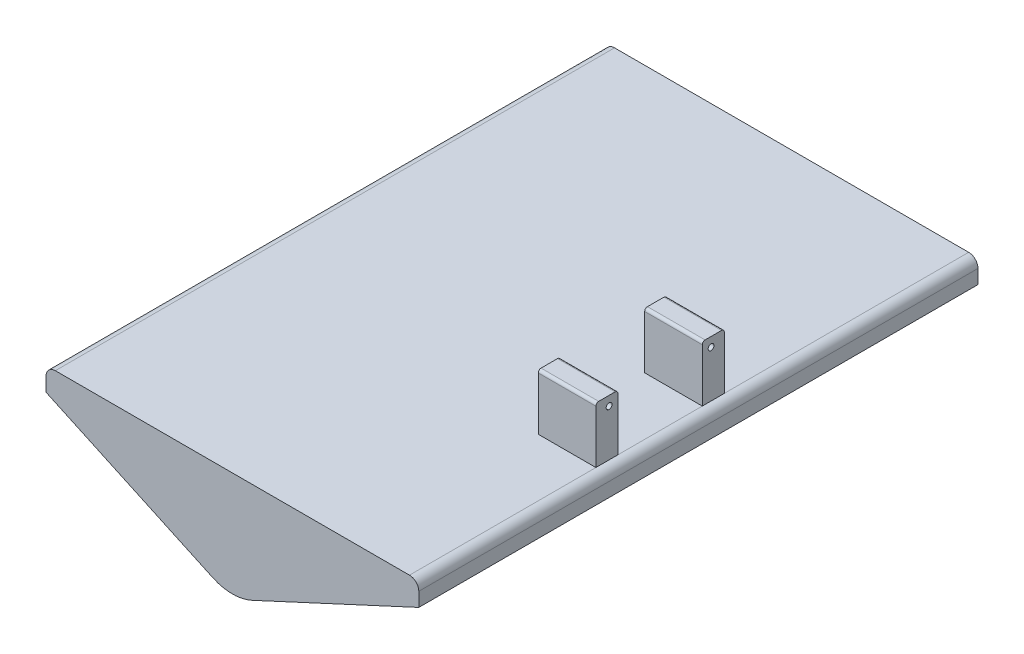
ISO-10303-21;
HEADER;
FILE_DESCRIPTION(('STEP AP214'),'2;1');
FILE_NAME('part.step','',(''),(''),'','','');
FILE_SCHEMA(('AUTOMOTIVE_DESIGN { 1 0 10303 214 1 1 1 1 }'));
ENDSEC;
DATA;
#1=APPLICATION_CONTEXT('core data for automotive mechanical design processes');
#2=APPLICATION_PROTOCOL_DEFINITION('international standard','automotive_design',2000,#1);
#3=PRODUCT_CONTEXT('',#1,'mechanical');
#4=PRODUCT('Part','Part','',(#3));
#5=PRODUCT_RELATED_PRODUCT_CATEGORY('part','',(#4));
#6=PRODUCT_DEFINITION_FORMATION('','',#4);
#7=PRODUCT_DEFINITION_CONTEXT('part definition',#1,'design');
#8=PRODUCT_DEFINITION('design','',#6,#7);
#9=PRODUCT_DEFINITION_SHAPE('','',#8);
#10=(LENGTH_UNIT() NAMED_UNIT(*) SI_UNIT(.MILLI.,.METRE.));
#11=(NAMED_UNIT(*) PLANE_ANGLE_UNIT() SI_UNIT($,.RADIAN.));
#12=(NAMED_UNIT(*) SI_UNIT($,.STERADIAN.) SOLID_ANGLE_UNIT());
#13=UNCERTAINTY_MEASURE_WITH_UNIT(LENGTH_MEASURE(1.E-05),#10,'distance_accuracy_value','');
#14=(GEOMETRIC_REPRESENTATION_CONTEXT(3) GLOBAL_UNCERTAINTY_ASSIGNED_CONTEXT((#13)) GLOBAL_UNIT_ASSIGNED_CONTEXT((#10,
#11,#12)) REPRESENTATION_CONTEXT('',''));
#15=CARTESIAN_POINT('',(0.,0.,0.));
#16=DIRECTION('',(0.,0.,1.));
#17=DIRECTION('',(1.,0.,0.));
#18=AXIS2_PLACEMENT_3D('',#15,#16,#17);
#19=CARTESIAN_POINT('',(0.,3.175,152.4));
#20=DIRECTION('',(0.,1.,0.));
#21=DIRECTION('',(0.,0.,1.));
#22=AXIS2_PLACEMENT_3D('',#19,#20,#21);
#23=PLANE('',#22);
#24=DIRECTION('',(0.,0.,1.));
#25=VECTOR('',#24,1.);
#26=CARTESIAN_POINT('',(32.5600000000001,3.175,66.6));
#27=LINE('',#26,#25);
#28=CARTESIAN_POINT('',(32.5600000000001,3.175,66.6));
#29=VERTEX_POINT('',#28);
#30=CARTESIAN_POINT('',(32.5600000000001,3.175,72.6));
#31=VERTEX_POINT('',#30);
#32=EDGE_CURVE('E235',#29,#31,#27,.T.);
#33=ORIENTED_EDGE('',*,*,#32,.F.);
#34=DIRECTION('',(-1.,0.,0.));
#35=VECTOR('',#34,1.);
#36=CARTESIAN_POINT('',(48.2600000000001,3.175,66.6));
#37=LINE('',#36,#35);
#38=CARTESIAN_POINT('',(48.2600000000001,3.175,66.6));
#39=VERTEX_POINT('',#38);
#40=EDGE_CURVE('E208',#39,#29,#37,.T.);
#41=ORIENTED_EDGE('',*,*,#40,.F.);
#42=DIRECTION('',(0.,0.,-1.));
#43=VECTOR('',#42,1.);
#44=CARTESIAN_POINT('',(48.2600000000001,3.175,152.4));
#45=LINE('',#44,#43);
#46=CARTESIAN_POINT('',(48.2600000000001,3.175,0.));
#47=VERTEX_POINT('',#46);
#48=EDGE_CURVE('E217',#39,#47,#45,.T.);
#49=ORIENTED_EDGE('',*,*,#48,.T.);
#50=DIRECTION('',(1.,0.,0.));
#51=VECTOR('',#50,1.);
#52=CARTESIAN_POINT('',(0.,3.175,0.));
#53=LINE('',#52,#51);
#54=CARTESIAN_POINT('',(-48.2599999999999,3.175,0.));
#55=VERTEX_POINT('',#54);
#56=EDGE_CURVE('E339',#55,#47,#53,.T.);
#57=ORIENTED_EDGE('',*,*,#56,.F.);
#58=DIRECTION('',(0.,0.,-1.));
#59=VECTOR('',#58,1.);
#60=CARTESIAN_POINT('',(-48.2599999999999,3.175,152.4));
#61=LINE('',#60,#59);
#62=CARTESIAN_POINT('',(-48.2599999999999,3.175,152.4));
#63=VERTEX_POINT('',#62);
#64=EDGE_CURVE('E367',#55,#63,#61,.F.);
#65=ORIENTED_EDGE('',*,*,#64,.T.);
#66=DIRECTION('',(1.,0.,0.));
#67=VECTOR('',#66,1.);
#68=CARTESIAN_POINT('',(0.,3.175,152.4));
#69=LINE('',#68,#67);
#70=CARTESIAN_POINT('',(48.2600000000001,3.175,152.4));
#71=VERTEX_POINT('',#70);
#72=EDGE_CURVE('E323',#63,#71,#69,.T.);
#73=ORIENTED_EDGE('',*,*,#72,.T.);
#74=CARTESIAN_POINT('',(48.2600000000001,3.175,101.6));
#75=VERTEX_POINT('',#74);
#76=EDGE_CURVE('E231',#71,#75,#45,.T.);
#77=ORIENTED_EDGE('',*,*,#76,.T.);
#78=DIRECTION('',(1.,0.,0.));
#79=VECTOR('',#78,1.);
#80=CARTESIAN_POINT('',(48.2600000000001,3.175,101.6));
#81=LINE('',#80,#79);
#82=CARTESIAN_POINT('',(32.5600000000001,3.175,101.6));
#83=VERTEX_POINT('',#82);
#84=EDGE_CURVE('E257',#83,#75,#81,.T.);
#85=ORIENTED_EDGE('',*,*,#84,.F.);
#86=DIRECTION('',(0.,0.,1.));
#87=VECTOR('',#86,1.);
#88=CARTESIAN_POINT('',(32.5600000000001,3.175,95.6));
#89=LINE('',#88,#87);
#90=CARTESIAN_POINT('',(32.5600000000001,3.175,95.6));
#91=VERTEX_POINT('',#90);
#92=EDGE_CURVE('E263',#91,#83,#89,.T.);
#93=ORIENTED_EDGE('',*,*,#92,.F.);
#94=DIRECTION('',(-1.,0.,0.));
#95=VECTOR('',#94,1.);
#96=CARTESIAN_POINT('',(48.2600000000001,3.175,95.6));
#97=LINE('',#96,#95);
#98=CARTESIAN_POINT('',(48.2600000000001,3.175,95.6));
#99=VERTEX_POINT('',#98);
#100=EDGE_CURVE('E242',#99,#91,#97,.T.);
#101=ORIENTED_EDGE('',*,*,#100,.F.);
#102=CARTESIAN_POINT('',(48.2600000000001,3.175,72.6));
#103=VERTEX_POINT('',#102);
#104=EDGE_CURVE('E228',#99,#103,#45,.T.);
#105=ORIENTED_EDGE('',*,*,#104,.T.);
#106=DIRECTION('',(1.,0.,0.));
#107=VECTOR('',#106,1.);
#108=CARTESIAN_POINT('',(48.2600000000001,3.175,72.6));
#109=LINE('',#108,#107);
#110=EDGE_CURVE('E252',#31,#103,#109,.T.);
#111=ORIENTED_EDGE('',*,*,#110,.F.);
#112=EDGE_LOOP('',(#33,#41,#49,#57,#65,#73,#77,#85,#93,#101,#105,#111));
#113=FACE_BOUND('',#112,.T.);
#114=ADVANCED_FACE('F45',(#113),#23,.T.);
#115=CARTESIAN_POINT('',(-10.1779518832667,-21.9828280773283,152.4));
#116=DIRECTION('',(0.420147930242184,0.907455627958309,0.));
#117=DIRECTION('',(-0.907455627958309,0.420147930242184,0.));
#118=AXIS2_PLACEMENT_3D('',#115,#116,#117);
#119=PLANE('',#118);
#120=DIRECTION('',(0.,0.,-1.));
#121=VECTOR('',#120,1.);
#122=CARTESIAN_POINT('',(-5.33587871407572,-24.2246864750705,152.4));
#123=LINE('',#122,#121);
#124=CARTESIAN_POINT('',(-5.33587871407572,-24.2246864750705,57.15));
#125=VERTEX_POINT('',#124);
#126=CARTESIAN_POINT('',(-5.33587871407572,-24.2246864750705,0.));
#127=VERTEX_POINT('',#126);
#128=EDGE_CURVE('E353',#125,#127,#123,.T.);
#129=ORIENTED_EDGE('',*,*,#128,.F.);
#130=DIRECTION('',(-0.907455627958309,0.420147930242184,0.));
#131=VECTOR('',#130,1.);
#132=CARTESIAN_POINT('',(-10.1779518832667,-21.9828280773283,57.15));
#133=LINE('',#132,#131);
#134=CARTESIAN_POINT('',(-50.7999999999999,-3.175,57.15));
#135=VERTEX_POINT('',#134);
#136=EDGE_CURVE('E302',#125,#135,#133,.T.);
#137=ORIENTED_EDGE('',*,*,#136,.T.);
#138=DIRECTION('',(0.,0.,-1.));
#139=VECTOR('',#138,1.);
#140=CARTESIAN_POINT('',(-50.7999999999999,-3.17499999999999,152.4));
#141=LINE('',#140,#139);
#142=CARTESIAN_POINT('',(-50.7999999999999,-3.17499999999999,0.));
#143=VERTEX_POINT('',#142);
#144=EDGE_CURVE('E328',#135,#143,#141,.T.);
#145=ORIENTED_EDGE('',*,*,#144,.T.);
#146=DIRECTION('',(0.907455627958309,-0.420147930242184,0.));
#147=VECTOR('',#146,1.);
#148=CARTESIAN_POINT('',(-10.1779518832667,-21.9828280773283,0.));
#149=LINE('',#148,#147);
#150=EDGE_CURVE('E309',#143,#127,#149,.T.);
#151=ORIENTED_EDGE('',*,*,#150,.T.);
#152=EDGE_LOOP('',(#129,#137,#145,#151));
#153=FACE_BOUND('',#152,.T.);
#154=ADVANCED_FACE('F469',(#153),#119,.F.);
#155=CARTESIAN_POINT('',(0.,-12.7,152.4));
#156=DIRECTION('',(0.,0.,-1.));
#157=DIRECTION('',(-1.,0.,0.));
#158=AXIS2_PLACEMENT_3D('',#155,#156,#157);
#159=CYLINDRICAL_SURFACE('',#158,12.7);
#160=CARTESIAN_POINT('',(-5.33587871407572,-24.2246864750705,152.4));
#161=VERTEX_POINT('',#160);
#162=CARTESIAN_POINT('',(-5.33587871407572,-24.2246864750705,95.25));
#163=VERTEX_POINT('',#162);
#164=EDGE_CURVE('E354',#161,#163,#123,.T.);
#165=ORIENTED_EDGE('',*,*,#164,.T.);
#166=CARTESIAN_POINT('',(0.,-12.7,95.25));
#167=DIRECTION('',(0.,0.,1.));
#168=DIRECTION('',(1.,0.,0.));
#169=AXIS2_PLACEMENT_3D('',#166,#167,#168);
#170=CIRCLE('',#169,12.7);
#171=CARTESIAN_POINT('',(5.33587871407572,-24.2246864750705,95.25));
#172=VERTEX_POINT('',#171);
#173=EDGE_CURVE('E291',#163,#172,#170,.T.);
#174=ORIENTED_EDGE('',*,*,#173,.T.);
#175=DIRECTION('',(0.,0.,-1.));
#176=VECTOR('',#175,1.);
#177=CARTESIAN_POINT('',(5.33587871407572,-24.2246864750705,152.4));
#178=LINE('',#177,#176);
#179=CARTESIAN_POINT('',(5.33587871407572,-24.2246864750705,152.4));
#180=VERTEX_POINT('',#179);
#181=EDGE_CURVE('E350',#180,#172,#178,.T.);
#182=ORIENTED_EDGE('',*,*,#181,.F.);
#183=CARTESIAN_POINT('',(0.,-12.7,152.4));
#184=DIRECTION('',(0.,0.,1.));
#185=DIRECTION('',(1.,0.,0.));
#186=AXIS2_PLACEMENT_3D('',#183,#184,#185);
#187=CIRCLE('',#186,12.7);
#188=EDGE_CURVE('E315',#161,#180,#187,.T.);
#189=ORIENTED_EDGE('',*,*,#188,.F.);
#190=EDGE_LOOP('',(#165,#174,#182,#189));
#191=FACE_BOUND('',#190,.T.);
#192=ADVANCED_FACE('F474',(#191),#159,.T.);
#193=CARTESIAN_POINT('',(10.1779518832667,-21.9828280773283,152.4));
#194=DIRECTION('',(0.420147930242182,-0.90745562795831,0.));
#195=DIRECTION('',(0.90745562795831,0.420147930242183,0.));
#196=AXIS2_PLACEMENT_3D('',#193,#194,#195);
#197=PLANE('',#196);
#198=DIRECTION('',(0.90745562795831,0.420147930242183,0.));
#199=VECTOR('',#198,1.);
#200=CARTESIAN_POINT('',(10.1779518832667,-21.9828280773283,57.15));
#201=LINE('',#200,#199);
#202=CARTESIAN_POINT('',(5.33587871407572,-24.2246864750705,57.15));
#203=VERTEX_POINT('',#202);
#204=CARTESIAN_POINT('',(50.7999999999999,-3.175,57.15));
#205=VERTEX_POINT('',#204);
#206=EDGE_CURVE('E297',#203,#205,#201,.T.);
#207=ORIENTED_EDGE('',*,*,#206,.F.);
#208=CARTESIAN_POINT('',(5.33587871407572,-24.2246864750705,0.));
#209=VERTEX_POINT('',#208);
#210=EDGE_CURVE('E349',#203,#209,#178,.T.);
#211=ORIENTED_EDGE('',*,*,#210,.T.);
#212=DIRECTION('',(-0.90745562795831,-0.420147930242182,0.));
#213=VECTOR('',#212,1.);
#214=CARTESIAN_POINT('',(10.1779518832667,-21.9828280773283,0.));
#215=LINE('',#214,#213);
#216=CARTESIAN_POINT('',(50.8000000000001,-3.175,0.));
#217=VERTEX_POINT('',#216);
#218=EDGE_CURVE('E334',#217,#209,#215,.T.);
#219=ORIENTED_EDGE('',*,*,#218,.F.);
#220=DIRECTION('',(0.,0.,-1.));
#221=VECTOR('',#220,1.);
#222=CARTESIAN_POINT('',(50.8000000000001,-3.175,152.4));
#223=LINE('',#222,#221);
#224=EDGE_CURVE('E345',#205,#217,#223,.T.);
#225=ORIENTED_EDGE('',*,*,#224,.F.);
#226=EDGE_LOOP('',(#207,#211,#219,#225));
#227=FACE_BOUND('',#226,.T.);
#228=ADVANCED_FACE('F491',(#227),#197,.T.);
#229=CARTESIAN_POINT('',(0.,-12.7,0.));
#230=DIRECTION('',(0.,0.,1.));
#231=DIRECTION('',(1.,0.,0.));
#232=AXIS2_PLACEMENT_3D('',#229,#230,#231);
#233=CYLINDRICAL_SURFACE('',#232,6.985);
#234=CARTESIAN_POINT('',(0.,-12.7,57.15));
#235=DIRECTION('',(0.,0.,-1.));
#236=DIRECTION('',(-1.,0.,0.));
#237=AXIS2_PLACEMENT_3D('',#234,#235,#236);
#238=CIRCLE('',#237,6.985);
#239=CARTESIAN_POINT('',(-6.985,-12.7,57.15));
#240=VERTEX_POINT('',#239);
#241=EDGE_CURVE('E296',#240,#240,#238,.F.);
#242=ORIENTED_EDGE('',*,*,#241,.T.);
#243=EDGE_LOOP('',(#242));
#244=FACE_BOUND('',#243,.T.);
#245=CARTESIAN_POINT('',(0.,-12.7,0.));
#246=DIRECTION('',(0.,0.,1.));
#247=DIRECTION('',(1.,0.,0.));
#248=AXIS2_PLACEMENT_3D('',#245,#246,#247);
#249=CIRCLE('',#248,6.985);
#250=CARTESIAN_POINT('',(6.985,-12.7,0.));
#251=VERTEX_POINT('',#250);
#252=EDGE_CURVE('E306',#251,#251,#249,.T.);
#253=ORIENTED_EDGE('',*,*,#252,.F.);
#254=EDGE_LOOP('',(#253));
#255=FACE_BOUND('',#254,.T.);
#256=ADVANCED_FACE('F496',(#244,#255),#233,.F.);
#257=CARTESIAN_POINT('',(-50.7999999999999,-3.17499999999999,152.4));
#258=VERTEX_POINT('',#257);
#259=CARTESIAN_POINT('',(-50.7999999999999,-3.17499999999999,95.25));
#260=VERTEX_POINT('',#259);
#261=EDGE_CURVE('E342',#258,#260,#141,.T.);
#262=ORIENTED_EDGE('',*,*,#261,.T.);
#263=DIRECTION('',(0.907455627958309,-0.420147930242184,0.));
#264=VECTOR('',#263,1.);
#265=CARTESIAN_POINT('',(-10.1779518832667,-21.9828280773283,95.25));
#266=LINE('',#265,#264);
#267=EDGE_CURVE('E293',#260,#163,#266,.T.);
#268=ORIENTED_EDGE('',*,*,#267,.T.);
#269=ORIENTED_EDGE('',*,*,#164,.F.);
#270=DIRECTION('',(0.907455627958309,-0.420147930242184,0.));
#271=VECTOR('',#270,1.);
#272=CARTESIAN_POINT('',(-10.1779518832667,-21.9828280773283,152.4));
#273=LINE('',#272,#271);
#274=EDGE_CURVE('E312',#258,#161,#273,.T.);
#275=ORIENTED_EDGE('',*,*,#274,.F.);
#276=EDGE_LOOP('',(#262,#268,#269,#275));
#277=FACE_BOUND('',#276,.T.);
#278=ADVANCED_FACE('F477',(#277),#119,.F.);
#279=ORIENTED_EDGE('',*,*,#210,.F.);
#280=CARTESIAN_POINT('',(0.,-12.7,57.15));
#281=DIRECTION('',(0.,0.,-1.));
#282=DIRECTION('',(-1.,0.,0.));
#283=AXIS2_PLACEMENT_3D('',#280,#281,#282);
#284=CIRCLE('',#283,12.7);
#285=EDGE_CURVE('E299',#203,#125,#284,.T.);
#286=ORIENTED_EDGE('',*,*,#285,.T.);
#287=ORIENTED_EDGE('',*,*,#128,.T.);
#288=CARTESIAN_POINT('',(0.,-12.7,0.));
#289=DIRECTION('',(0.,0.,1.));
#290=DIRECTION('',(1.,0.,0.));
#291=AXIS2_PLACEMENT_3D('',#288,#289,#290);
#292=CIRCLE('',#291,12.7);
#293=EDGE_CURVE('E331',#127,#209,#292,.T.);
#294=ORIENTED_EDGE('',*,*,#293,.T.);
#295=EDGE_LOOP('',(#279,#286,#287,#294));
#296=FACE_BOUND('',#295,.T.);
#297=ADVANCED_FACE('F489',(#296),#159,.T.);
#298=DIRECTION('',(-0.90745562795831,-0.420147930242183,0.));
#299=VECTOR('',#298,1.);
#300=CARTESIAN_POINT('',(10.1779518832667,-21.9828280773283,95.25));
#301=LINE('',#300,#299);
#302=CARTESIAN_POINT('',(50.7999999999999,-3.175,95.25));
#303=VERTEX_POINT('',#302);
#304=EDGE_CURVE('E288',#303,#172,#301,.T.);
#305=ORIENTED_EDGE('',*,*,#304,.F.);
#306=CARTESIAN_POINT('',(50.8000000000001,-3.175,152.4));
#307=VERTEX_POINT('',#306);
#308=EDGE_CURVE('E346',#307,#303,#223,.T.);
#309=ORIENTED_EDGE('',*,*,#308,.F.);
#310=DIRECTION('',(-0.90745562795831,-0.420147930242182,0.));
#311=VECTOR('',#310,1.);
#312=CARTESIAN_POINT('',(10.1779518832667,-21.9828280773283,152.4));
#313=LINE('',#312,#311);
#314=EDGE_CURVE('E318',#307,#180,#313,.T.);
#315=ORIENTED_EDGE('',*,*,#314,.T.);
#316=ORIENTED_EDGE('',*,*,#181,.T.);
#317=EDGE_LOOP('',(#305,#309,#315,#316));
#318=FACE_BOUND('',#317,.T.);
#319=ADVANCED_FACE('F485',(#318),#197,.T.);
#320=CARTESIAN_POINT('',(50.8000000000001,0.,152.4));
#321=DIRECTION('',(1.,0.,0.));
#322=DIRECTION('',(0.,1.,0.));
#323=AXIS2_PLACEMENT_3D('',#320,#321,#322);
#324=PLANE('',#323);
#325=DIRECTION('',(0.,-1.,0.));
#326=VECTOR('',#325,1.);
#327=CARTESIAN_POINT('',(50.8000000000001,0.,0.));
#328=LINE('',#327,#326);
#329=CARTESIAN_POINT('',(50.8000000000001,0.635000000000002,0.));
#330=VERTEX_POINT('',#329);
#331=EDGE_CURVE('E337',#330,#217,#328,.T.);
#332=ORIENTED_EDGE('',*,*,#331,.F.);
#333=DIRECTION('',(0.,0.,-1.));
#334=VECTOR('',#333,1.);
#335=CARTESIAN_POINT('',(50.8000000000001,0.635000000000002,152.4));
#336=LINE('',#335,#334);
#337=CARTESIAN_POINT('',(50.8000000000001,0.635000000000002,152.4));
#338=VERTEX_POINT('',#337);
#339=EDGE_CURVE('E373',#330,#338,#336,.F.);
#340=ORIENTED_EDGE('',*,*,#339,.T.);
#341=DIRECTION('',(0.,-1.,0.));
#342=VECTOR('',#341,1.);
#343=CARTESIAN_POINT('',(50.8000000000001,0.,152.4));
#344=LINE('',#343,#342);
#345=EDGE_CURVE('E321',#338,#307,#344,.T.);
#346=ORIENTED_EDGE('',*,*,#345,.T.);
#347=ORIENTED_EDGE('',*,*,#308,.T.);
#348=DIRECTION('',(0.,0.,-1.));
#349=VECTOR('',#348,1.);
#350=CARTESIAN_POINT('',(50.7999999999999,-3.175,57.15));
#351=LINE('',#350,#349);
#352=EDGE_CURVE('E281',#303,#205,#351,.T.);
#353=ORIENTED_EDGE('',*,*,#352,.T.);
#354=ORIENTED_EDGE('',*,*,#224,.T.);
#355=EDGE_LOOP('',(#332,#340,#346,#347,#353,#354));
#356=FACE_BOUND('',#355,.T.);
#357=ADVANCED_FACE('F482',(#356),#324,.T.);
#358=CARTESIAN_POINT('',(-50.7999999999999,0.,152.4));
#359=DIRECTION('',(1.,0.,0.));
#360=DIRECTION('',(0.,1.,0.));
#361=AXIS2_PLACEMENT_3D('',#358,#359,#360);
#362=PLANE('',#361);
#363=DIRECTION('',(0.,-1.,0.));
#364=VECTOR('',#363,1.);
#365=CARTESIAN_POINT('',(-50.7999999999999,0.,152.4));
#366=LINE('',#365,#364);
#367=CARTESIAN_POINT('',(-50.7999999999999,0.635000000000007,152.4));
#368=VERTEX_POINT('',#367);
#369=EDGE_CURVE('E326',#368,#258,#366,.T.);
#370=ORIENTED_EDGE('',*,*,#369,.F.);
#371=DIRECTION('',(0.,0.,-1.));
#372=VECTOR('',#371,1.);
#373=CARTESIAN_POINT('',(-50.7999999999999,0.635000000000007,0.));
#374=LINE('',#373,#372);
#375=CARTESIAN_POINT('',(-50.7999999999999,0.635000000000007,0.));
#376=VERTEX_POINT('',#375);
#377=EDGE_CURVE('E357',#368,#376,#374,.T.);
#378=ORIENTED_EDGE('',*,*,#377,.T.);
#379=DIRECTION('',(0.,-1.,0.));
#380=VECTOR('',#379,1.);
#381=CARTESIAN_POINT('',(-50.7999999999999,0.,0.));
#382=LINE('',#381,#380);
#383=EDGE_CURVE('E316',#376,#143,#382,.T.);
#384=ORIENTED_EDGE('',*,*,#383,.T.);
#385=ORIENTED_EDGE('',*,*,#144,.F.);
#386=DIRECTION('',(0.,0.,1.));
#387=VECTOR('',#386,1.);
#388=CARTESIAN_POINT('',(-50.7999999999999,-3.175,57.15));
#389=LINE('',#388,#387);
#390=EDGE_CURVE('E275',#135,#260,#389,.T.);
#391=ORIENTED_EDGE('',*,*,#390,.T.);
#392=ORIENTED_EDGE('',*,*,#261,.F.);
#393=EDGE_LOOP('',(#370,#378,#384,#385,#391,#392));
#394=FACE_BOUND('',#393,.T.);
#395=ADVANCED_FACE('F480',(#394),#362,.F.);
#396=CARTESIAN_POINT('',(0.,0.,152.4));
#397=DIRECTION('',(0.,0.,1.));
#398=DIRECTION('',(1.,0.,0.));
#399=AXIS2_PLACEMENT_3D('',#396,#397,#398);
#400=PLANE('',#399);
#401=ORIENTED_EDGE('',*,*,#72,.F.);
#402=CARTESIAN_POINT('',(-48.2599999999999,0.635000000000004,152.4));
#403=DIRECTION('',(0.,0.,1.));
#404=DIRECTION('',(1.,0.,0.));
#405=AXIS2_PLACEMENT_3D('',#402,#403,#404);
#406=CIRCLE('',#405,2.54);
#407=EDGE_CURVE('E371',#63,#368,#406,.T.);
#408=ORIENTED_EDGE('',*,*,#407,.T.);
#409=ORIENTED_EDGE('',*,*,#369,.T.);
#410=ORIENTED_EDGE('',*,*,#274,.T.);
#411=ORIENTED_EDGE('',*,*,#188,.T.);
#412=ORIENTED_EDGE('',*,*,#314,.F.);
#413=ORIENTED_EDGE('',*,*,#345,.F.);
#414=CARTESIAN_POINT('',(48.2600000000001,0.635000000000004,152.4));
#415=DIRECTION('',(0.,0.,1.));
#416=DIRECTION('',(1.,0.,0.));
#417=AXIS2_PLACEMENT_3D('',#414,#415,#416);
#418=CIRCLE('',#417,2.54);
#419=EDGE_CURVE('E369',#338,#71,#418,.T.);
#420=ORIENTED_EDGE('',*,*,#419,.T.);
#421=EDGE_LOOP('',(#401,#408,#409,#410,#411,#412,#413,#420));
#422=FACE_BOUND('',#421,.T.);
#423=ADVANCED_FACE('F699',(#422),#400,.T.);
#424=CARTESIAN_POINT('',(0.,0.,0.));
#425=DIRECTION('',(0.,0.,1.));
#426=DIRECTION('',(1.,0.,0.));
#427=AXIS2_PLACEMENT_3D('',#424,#425,#426);
#428=PLANE('',#427);
#429=ORIENTED_EDGE('',*,*,#252,.T.);
#430=EDGE_LOOP('',(#429));
#431=FACE_BOUND('',#430,.T.);
#432=ORIENTED_EDGE('',*,*,#383,.F.);
#433=CARTESIAN_POINT('',(-48.2599999999999,0.635000000000004,0.));
#434=DIRECTION('',(0.,0.,1.));
#435=DIRECTION('',(1.,0.,0.));
#436=AXIS2_PLACEMENT_3D('',#433,#434,#435);
#437=CIRCLE('',#436,2.54);
#438=EDGE_CURVE('E229',#376,#55,#437,.F.);
#439=ORIENTED_EDGE('',*,*,#438,.T.);
#440=ORIENTED_EDGE('',*,*,#56,.T.);
#441=CARTESIAN_POINT('',(48.2600000000001,0.635000000000004,0.));
#442=DIRECTION('',(0.,0.,1.));
#443=DIRECTION('',(1.,0.,0.));
#444=AXIS2_PLACEMENT_3D('',#441,#442,#443);
#445=CIRCLE('',#444,2.54);
#446=EDGE_CURVE('E224',#47,#330,#445,.F.);
#447=ORIENTED_EDGE('',*,*,#446,.T.);
#448=ORIENTED_EDGE('',*,*,#331,.T.);
#449=ORIENTED_EDGE('',*,*,#218,.T.);
#450=ORIENTED_EDGE('',*,*,#293,.F.);
#451=ORIENTED_EDGE('',*,*,#150,.F.);
#452=EDGE_LOOP('',(#432,#439,#440,#447,#448,#449,#450,#451));
#453=FACE_BOUND('',#452,.T.);
#454=ADVANCED_FACE('F689',(#431,#453),#428,.F.);
#455=CARTESIAN_POINT('',(-50.7999999999999,-25.4,57.15));
#456=DIRECTION('',(0.,0.,-1.));
#457=DIRECTION('',(-1.,0.,0.));
#458=AXIS2_PLACEMENT_3D('',#455,#456,#457);
#459=PLANE('',#458);
#460=ORIENTED_EDGE('',*,*,#241,.F.);
#461=EDGE_LOOP('',(#460));
#462=FACE_BOUND('',#461,.T.);
#463=ORIENTED_EDGE('',*,*,#285,.F.);
#464=ORIENTED_EDGE('',*,*,#206,.T.);
#465=DIRECTION('',(-1.,0.,0.));
#466=VECTOR('',#465,1.);
#467=CARTESIAN_POINT('',(-50.7999999999999,-3.175,57.15));
#468=LINE('',#467,#466);
#469=EDGE_CURVE('E284',#205,#135,#468,.T.);
#470=ORIENTED_EDGE('',*,*,#469,.T.);
#471=ORIENTED_EDGE('',*,*,#136,.F.);
#472=EDGE_LOOP('',(#463,#464,#470,#471));
#473=FACE_BOUND('',#472,.T.);
#474=ADVANCED_FACE('F679',(#462,#473),#459,.F.);
#475=CARTESIAN_POINT('',(-50.7999999999999,-25.4,95.25));
#476=DIRECTION('',(0.,0.,1.));
#477=DIRECTION('',(1.,0.,0.));
#478=AXIS2_PLACEMENT_3D('',#475,#476,#477);
#479=PLANE('',#478);
#480=CARTESIAN_POINT('',(0.,-12.7,95.25));
#481=DIRECTION('',(0.,0.,1.));
#482=DIRECTION('',(1.,0.,0.));
#483=AXIS2_PLACEMENT_3D('',#480,#481,#482);
#484=CIRCLE('',#483,6.985);
#485=CARTESIAN_POINT('',(6.985,-12.7,95.25));
#486=VERTEX_POINT('',#485);
#487=EDGE_CURVE('E287',#486,#486,#484,.F.);
#488=ORIENTED_EDGE('',*,*,#487,.F.);
#489=EDGE_LOOP('',(#488));
#490=FACE_BOUND('',#489,.T.);
#491=DIRECTION('',(1.,0.,0.));
#492=VECTOR('',#491,1.);
#493=CARTESIAN_POINT('',(-50.7999999999999,-3.175,95.25));
#494=LINE('',#493,#492);
#495=EDGE_CURVE('E278',#260,#303,#494,.T.);
#496=ORIENTED_EDGE('',*,*,#495,.T.);
#497=ORIENTED_EDGE('',*,*,#304,.T.);
#498=ORIENTED_EDGE('',*,*,#173,.F.);
#499=ORIENTED_EDGE('',*,*,#267,.F.);
#500=EDGE_LOOP('',(#496,#497,#498,#499));
#501=FACE_BOUND('',#500,.T.);
#502=ADVANCED_FACE('F669',(#490,#501),#479,.F.);
#503=CARTESIAN_POINT('',(0.,-3.175,0.));
#504=DIRECTION('',(0.,1.,0.));
#505=DIRECTION('',(0.,0.,1.));
#506=AXIS2_PLACEMENT_3D('',#503,#504,#505);
#507=PLANE('',#506);
#508=ORIENTED_EDGE('',*,*,#390,.F.);
#509=ORIENTED_EDGE('',*,*,#469,.F.);
#510=ORIENTED_EDGE('',*,*,#352,.F.);
#511=ORIENTED_EDGE('',*,*,#495,.F.);
#512=EDGE_LOOP('',(#508,#509,#510,#511));
#513=FACE_BOUND('',#512,.T.);
#514=ADVANCED_FACE('F659',(#513),#507,.F.);
#515=CARTESIAN_POINT('',(0.,0.,146.05));
#516=DIRECTION('',(0.,0.,1.));
#517=DIRECTION('',(1.,0.,0.));
#518=AXIS2_PLACEMENT_3D('',#515,#516,#517);
#519=PLANE('',#518);
#520=CARTESIAN_POINT('',(0.,-12.7,146.05));
#521=DIRECTION('',(0.,0.,1.));
#522=DIRECTION('',(1.,0.,0.));
#523=AXIS2_PLACEMENT_3D('',#520,#521,#522);
#524=CIRCLE('',#523,6.985);
#525=CARTESIAN_POINT('',(6.985,-12.7,146.05));
#526=VERTEX_POINT('',#525);
#527=EDGE_CURVE('E305',#526,#526,#524,.T.);
#528=ORIENTED_EDGE('',*,*,#527,.F.);
#529=EDGE_LOOP('',(#528));
#530=FACE_BOUND('',#529,.T.);
#531=ADVANCED_FACE('F647',(#530),#519,.F.);
#532=ORIENTED_EDGE('',*,*,#487,.T.);
#533=EDGE_LOOP('',(#532));
#534=FACE_BOUND('',#533,.T.);
#535=ORIENTED_EDGE('',*,*,#527,.T.);
#536=EDGE_LOOP('',(#535));
#537=FACE_BOUND('',#536,.T.);
#538=ADVANCED_FACE('F501',(#534,#537),#233,.F.);
#539=CARTESIAN_POINT('',(-48.2599999999999,0.635000000000004,152.4));
#540=DIRECTION('',(0.,0.,1.));
#541=DIRECTION('',(1.,0.,0.));
#542=AXIS2_PLACEMENT_3D('',#539,#540,#541);
#543=CYLINDRICAL_SURFACE('',#542,2.54);
#544=ORIENTED_EDGE('',*,*,#407,.F.);
#545=ORIENTED_EDGE('',*,*,#64,.F.);
#546=ORIENTED_EDGE('',*,*,#438,.F.);
#547=ORIENTED_EDGE('',*,*,#377,.F.);
#548=EDGE_LOOP('',(#544,#545,#546,#547));
#549=FACE_BOUND('',#548,.T.);
#550=ADVANCED_FACE('F498',(#549),#543,.T.);
#551=CARTESIAN_POINT('',(48.2600000000001,0.635000000000004,152.4));
#552=DIRECTION('',(0.,0.,-1.));
#553=DIRECTION('',(-1.,0.,0.));
#554=AXIS2_PLACEMENT_3D('',#551,#552,#553);
#555=CYLINDRICAL_SURFACE('',#554,2.54);
#556=ORIENTED_EDGE('',*,*,#419,.F.);
#557=ORIENTED_EDGE('',*,*,#339,.F.);
#558=ORIENTED_EDGE('',*,*,#446,.F.);
#559=ORIENTED_EDGE('',*,*,#48,.F.);
#560=DIRECTION('',(0.,0.,-1.));
#561=VECTOR('',#560,1.);
#562=CARTESIAN_POINT('',(48.2600000000001,3.175,66.6));
#563=LINE('',#562,#561);
#564=EDGE_CURVE('E221',#103,#39,#563,.T.);
#565=ORIENTED_EDGE('',*,*,#564,.F.);
#566=ORIENTED_EDGE('',*,*,#104,.F.);
#567=DIRECTION('',(0.,0.,-1.));
#568=VECTOR('',#567,1.);
#569=CARTESIAN_POINT('',(48.2600000000001,3.175,95.6));
#570=LINE('',#569,#568);
#571=EDGE_CURVE('E239',#75,#99,#570,.T.);
#572=ORIENTED_EDGE('',*,*,#571,.F.);
#573=ORIENTED_EDGE('',*,*,#76,.F.);
#574=EDGE_LOOP('',(#556,#557,#558,#559,#565,#566,#572,#573));
#575=FACE_BOUND('',#574,.T.);
#576=ADVANCED_FACE('F219',(#575),#555,.T.);
#577=CARTESIAN_POINT('',(48.2600000000001,18.415,95.6));
#578=DIRECTION('',(-1.,0.,0.));
#579=DIRECTION('',(0.,0.,1.));
#580=AXIS2_PLACEMENT_3D('',#577,#578,#579);
#581=PLANE('',#580);
#582=CARTESIAN_POINT('',(48.2600000000001,15.875,97.995000084));
#583=DIRECTION('',(-1.,0.,0.));
#584=DIRECTION('',(0.,0.,1.));
#585=AXIS2_PLACEMENT_3D('',#582,#583,#584);
#586=CIRCLE('',#585,0.799999999999995);
#587=CARTESIAN_POINT('',(48.2600000000001,15.875,98.795000084));
#588=VERTEX_POINT('',#587);
#589=EDGE_CURVE('E212',#588,#588,#586,.T.);
#590=ORIENTED_EDGE('',*,*,#589,.T.);
#591=EDGE_LOOP('',(#590));
#592=FACE_BOUND('',#591,.T.);
#593=DIRECTION('',(0.,0.,-1.));
#594=VECTOR('',#593,1.);
#595=CARTESIAN_POINT('',(48.2600000000001,18.415,95.6));
#596=LINE('',#595,#594);
#597=CARTESIAN_POINT('',(48.2600000000001,18.415,100.838));
#598=VERTEX_POINT('',#597);
#599=CARTESIAN_POINT('',(48.2600000000001,18.415,96.362));
#600=VERTEX_POINT('',#599);
#601=EDGE_CURVE('E253',#598,#600,#596,.T.);
#602=ORIENTED_EDGE('',*,*,#601,.F.);
#603=CARTESIAN_POINT('',(48.2600000000001,17.653,100.838));
#604=DIRECTION('',(-1.,0.,0.));
#605=DIRECTION('',(0.,0.,1.));
#606=AXIS2_PLACEMENT_3D('',#603,#604,#605);
#607=CIRCLE('',#606,0.762);
#608=CARTESIAN_POINT('',(48.2600000000001,17.653,101.6));
#609=VERTEX_POINT('',#608);
#610=EDGE_CURVE('E383',#598,#609,#607,.F.);
#611=ORIENTED_EDGE('',*,*,#610,.T.);
#612=DIRECTION('',(0.,-1.,0.));
#613=VECTOR('',#612,1.);
#614=CARTESIAN_POINT('',(48.2600000000001,18.415,101.6));
#615=LINE('',#614,#613);
#616=EDGE_CURVE('E259',#609,#75,#615,.T.);
#617=ORIENTED_EDGE('',*,*,#616,.T.);
#618=ORIENTED_EDGE('',*,*,#571,.T.);
#619=DIRECTION('',(0.,-1.,0.));
#620=VECTOR('',#619,1.);
#621=CARTESIAN_POINT('',(48.2600000000001,18.415,95.6));
#622=LINE('',#621,#620);
#623=CARTESIAN_POINT('',(48.2600000000001,17.653,95.6));
#624=VERTEX_POINT('',#623);
#625=EDGE_CURVE('E273',#624,#99,#622,.T.);
#626=ORIENTED_EDGE('',*,*,#625,.F.);
#627=CARTESIAN_POINT('',(48.2600000000001,17.653,96.362));
#628=DIRECTION('',(-1.,0.,0.));
#629=DIRECTION('',(0.,0.,1.));
#630=AXIS2_PLACEMENT_3D('',#627,#628,#629);
#631=CIRCLE('',#630,0.762);
#632=EDGE_CURVE('E381',#624,#600,#631,.F.);
#633=ORIENTED_EDGE('',*,*,#632,.T.);
#634=EDGE_LOOP('',(#602,#611,#617,#618,#626,#633));
#635=FACE_BOUND('',#634,.T.);
#636=ADVANCED_FACE('F450',(#592,#635),#581,.F.);
#637=CARTESIAN_POINT('',(48.2600000000001,18.415,95.6));
#638=DIRECTION('',(0.,0.,1.));
#639=DIRECTION('',(1.,0.,0.));
#640=AXIS2_PLACEMENT_3D('',#637,#638,#639);
#641=PLANE('',#640);
#642=DIRECTION('',(0.,-1.,0.));
#643=VECTOR('',#642,1.);
#644=CARTESIAN_POINT('',(32.5600000000001,18.415,95.6));
#645=LINE('',#644,#643);
#646=CARTESIAN_POINT('',(32.5600000000001,17.653,95.6));
#647=VERTEX_POINT('',#646);
#648=EDGE_CURVE('E271',#647,#91,#645,.T.);
#649=ORIENTED_EDGE('',*,*,#648,.F.);
#650=DIRECTION('',(-1.,0.,0.));
#651=VECTOR('',#650,1.);
#652=CARTESIAN_POINT('',(48.2600000000001,17.653,95.6));
#653=LINE('',#652,#651);
#654=EDGE_CURVE('E391',#647,#624,#653,.F.);
#655=ORIENTED_EDGE('',*,*,#654,.T.);
#656=ORIENTED_EDGE('',*,*,#625,.T.);
#657=ORIENTED_EDGE('',*,*,#100,.T.);
#658=EDGE_LOOP('',(#649,#655,#656,#657));
#659=FACE_BOUND('',#658,.T.);
#660=ADVANCED_FACE('F457',(#659),#641,.F.);
#661=CARTESIAN_POINT('',(32.5600000000001,18.415,95.6));
#662=DIRECTION('',(1.,0.,0.));
#663=DIRECTION('',(0.,0.,-1.));
#664=AXIS2_PLACEMENT_3D('',#661,#662,#663);
#665=PLANE('',#664);
#666=CARTESIAN_POINT('',(32.5600000000001,15.875,97.995000084));
#667=DIRECTION('',(-1.,0.,0.));
#668=DIRECTION('',(0.,0.,1.));
#669=AXIS2_PLACEMENT_3D('',#666,#667,#668);
#670=CIRCLE('',#669,0.799999999999995);
#671=CARTESIAN_POINT('',(32.5600000000001,15.875,98.795000084));
#672=VERTEX_POINT('',#671);
#673=EDGE_CURVE('E963',#672,#672,#670,.T.);
#674=ORIENTED_EDGE('',*,*,#673,.F.);
#675=EDGE_LOOP('',(#674));
#676=FACE_BOUND('',#675,.T.);
#677=DIRECTION('',(0.,-1.,0.));
#678=VECTOR('',#677,1.);
#679=CARTESIAN_POINT('',(32.5600000000001,18.415,101.6));
#680=LINE('',#679,#678);
#681=CARTESIAN_POINT('',(32.5600000000001,17.653,101.6));
#682=VERTEX_POINT('',#681);
#683=EDGE_CURVE('E269',#682,#83,#680,.T.);
#684=ORIENTED_EDGE('',*,*,#683,.F.);
#685=CARTESIAN_POINT('',(32.5600000000001,17.653,100.838));
#686=DIRECTION('',(1.,0.,0.));
#687=DIRECTION('',(0.,0.,-1.));
#688=AXIS2_PLACEMENT_3D('',#685,#686,#687);
#689=CIRCLE('',#688,0.762);
#690=CARTESIAN_POINT('',(32.5600000000001,18.415,100.838));
#691=VERTEX_POINT('',#690);
#692=EDGE_CURVE('E389',#682,#691,#689,.F.);
#693=ORIENTED_EDGE('',*,*,#692,.T.);
#694=DIRECTION('',(0.,0.,1.));
#695=VECTOR('',#694,1.);
#696=CARTESIAN_POINT('',(32.5600000000001,18.415,95.6));
#697=LINE('',#696,#695);
#698=CARTESIAN_POINT('',(32.5600000000001,18.415,96.362));
#699=VERTEX_POINT('',#698);
#700=EDGE_CURVE('E256',#699,#691,#697,.T.);
#701=ORIENTED_EDGE('',*,*,#700,.F.);
#702=CARTESIAN_POINT('',(32.5600000000001,17.653,96.362));
#703=DIRECTION('',(1.,0.,0.));
#704=DIRECTION('',(0.,0.,-1.));
#705=AXIS2_PLACEMENT_3D('',#702,#703,#704);
#706=CIRCLE('',#705,0.762);
#707=EDGE_CURVE('E387',#699,#647,#706,.F.);
#708=ORIENTED_EDGE('',*,*,#707,.T.);
#709=ORIENTED_EDGE('',*,*,#648,.T.);
#710=ORIENTED_EDGE('',*,*,#92,.T.);
#711=EDGE_LOOP('',(#684,#693,#701,#708,#709,#710));
#712=FACE_BOUND('',#711,.T.);
#713=ADVANCED_FACE('F441',(#676,#712),#665,.F.);
#714=CARTESIAN_POINT('',(48.2600000000001,18.415,101.6));
#715=DIRECTION('',(0.,0.,-1.));
#716=DIRECTION('',(-1.,0.,0.));
#717=AXIS2_PLACEMENT_3D('',#714,#715,#716);
#718=PLANE('',#717);
#719=ORIENTED_EDGE('',*,*,#616,.F.);
#720=DIRECTION('',(1.,0.,0.));
#721=VECTOR('',#720,1.);
#722=CARTESIAN_POINT('',(48.2600000000001,17.653,101.6));
#723=LINE('',#722,#721);
#724=EDGE_CURVE('E385',#609,#682,#723,.F.);
#725=ORIENTED_EDGE('',*,*,#724,.T.);
#726=ORIENTED_EDGE('',*,*,#683,.T.);
#727=ORIENTED_EDGE('',*,*,#84,.T.);
#728=EDGE_LOOP('',(#719,#725,#726,#727));
#729=FACE_BOUND('',#728,.T.);
#730=ADVANCED_FACE('F436',(#729),#718,.F.);
#731=CARTESIAN_POINT('',(0.,18.415,0.));
#732=DIRECTION('',(0.,-1.,0.));
#733=DIRECTION('',(0.,0.,-1.));
#734=AXIS2_PLACEMENT_3D('',#731,#732,#733);
#735=PLANE('',#734);
#736=ORIENTED_EDGE('',*,*,#700,.T.);
#737=DIRECTION('',(1.,0.,0.));
#738=VECTOR('',#737,1.);
#739=CARTESIAN_POINT('',(0.,18.415,100.838));
#740=LINE('',#739,#738);
#741=EDGE_CURVE('E378',#691,#598,#740,.T.);
#742=ORIENTED_EDGE('',*,*,#741,.T.);
#743=ORIENTED_EDGE('',*,*,#601,.T.);
#744=DIRECTION('',(-1.,0.,0.));
#745=VECTOR('',#744,1.);
#746=CARTESIAN_POINT('',(0.,18.415,96.362));
#747=LINE('',#746,#745);
#748=EDGE_CURVE('E375',#600,#699,#747,.T.);
#749=ORIENTED_EDGE('',*,*,#748,.T.);
#750=EDGE_LOOP('',(#736,#742,#743,#749));
#751=FACE_BOUND('',#750,.T.);
#752=ADVANCED_FACE('F448',(#751),#735,.F.);
#753=CARTESIAN_POINT('',(48.2600000000001,18.415,66.6));
#754=DIRECTION('',(-1.,0.,0.));
#755=DIRECTION('',(0.,0.,1.));
#756=AXIS2_PLACEMENT_3D('',#753,#754,#755);
#757=PLANE('',#756);
#758=CARTESIAN_POINT('',(48.2600000000001,15.875,70.204999916));
#759=DIRECTION('',(-1.,0.,0.));
#760=DIRECTION('',(0.,0.,1.));
#761=AXIS2_PLACEMENT_3D('',#758,#759,#760);
#762=CIRCLE('',#761,0.799999999999995);
#763=CARTESIAN_POINT('',(48.2600000000001,15.875,71.004999916));
#764=VERTEX_POINT('',#763);
#765=EDGE_CURVE('E957',#764,#764,#762,.F.);
#766=ORIENTED_EDGE('',*,*,#765,.F.);
#767=EDGE_LOOP('',(#766));
#768=FACE_BOUND('',#767,.T.);
#769=DIRECTION('',(0.,-1.,0.));
#770=VECTOR('',#769,1.);
#771=CARTESIAN_POINT('',(48.2600000000001,18.415,66.6));
#772=LINE('',#771,#770);
#773=CARTESIAN_POINT('',(48.2600000000001,17.653,66.6));
#774=VERTEX_POINT('',#773);
#775=EDGE_CURVE('E204',#774,#39,#772,.T.);
#776=ORIENTED_EDGE('',*,*,#775,.F.);
#777=CARTESIAN_POINT('',(48.2600000000001,17.653,67.362));
#778=DIRECTION('',(-1.,0.,0.));
#779=DIRECTION('',(0.,0.,1.));
#780=AXIS2_PLACEMENT_3D('',#777,#778,#779);
#781=CIRCLE('',#780,0.762);
#782=CARTESIAN_POINT('',(48.2600000000001,18.415,67.362));
#783=VERTEX_POINT('',#782);
#784=EDGE_CURVE('E53',#774,#783,#781,.F.);
#785=ORIENTED_EDGE('',*,*,#784,.T.);
#786=DIRECTION('',(0.,0.,-1.));
#787=VECTOR('',#786,1.);
#788=CARTESIAN_POINT('',(48.2600000000001,18.415,66.6));
#789=LINE('',#788,#787);
#790=CARTESIAN_POINT('',(48.2600000000001,18.415,71.838));
#791=VERTEX_POINT('',#790);
#792=EDGE_CURVE('E249',#791,#783,#789,.T.);
#793=ORIENTED_EDGE('',*,*,#792,.F.);
#794=CARTESIAN_POINT('',(48.2600000000001,17.653,71.838));
#795=DIRECTION('',(-1.,0.,0.));
#796=DIRECTION('',(0.,0.,1.));
#797=AXIS2_PLACEMENT_3D('',#794,#795,#796);
#798=CIRCLE('',#797,0.762);
#799=CARTESIAN_POINT('',(48.2600000000001,17.653,72.6));
#800=VERTEX_POINT('',#799);
#801=EDGE_CURVE('E60',#791,#800,#798,.F.);
#802=ORIENTED_EDGE('',*,*,#801,.T.);
#803=DIRECTION('',(0.,-1.,0.));
#804=VECTOR('',#803,1.);
#805=CARTESIAN_POINT('',(48.2600000000001,18.415,72.6));
#806=LINE('',#805,#804);
#807=EDGE_CURVE('E238',#800,#103,#806,.T.);
#808=ORIENTED_EDGE('',*,*,#807,.T.);
#809=ORIENTED_EDGE('',*,*,#564,.T.);
#810=EDGE_LOOP('',(#776,#785,#793,#802,#808,#809));
#811=FACE_BOUND('',#810,.T.);
#812=ADVANCED_FACE('F237',(#768,#811),#757,.F.);
#813=CARTESIAN_POINT('',(48.2600000000001,18.415,66.6));
#814=DIRECTION('',(0.,0.,1.));
#815=DIRECTION('',(1.,0.,0.));
#816=AXIS2_PLACEMENT_3D('',#813,#814,#815);
#817=PLANE('',#816);
#818=DIRECTION('',(0.,-1.,0.));
#819=VECTOR('',#818,1.);
#820=CARTESIAN_POINT('',(32.5600000000001,18.415,66.6));
#821=LINE('',#820,#819);
#822=CARTESIAN_POINT('',(32.5600000000001,17.653,66.6));
#823=VERTEX_POINT('',#822);
#824=EDGE_CURVE('E211',#823,#29,#821,.T.);
#825=ORIENTED_EDGE('',*,*,#824,.F.);
#826=DIRECTION('',(-1.,0.,0.));
#827=VECTOR('',#826,1.);
#828=CARTESIAN_POINT('',(48.2600000000001,17.653,66.6));
#829=LINE('',#828,#827);
#830=EDGE_CURVE('E68',#823,#774,#829,.F.);
#831=ORIENTED_EDGE('',*,*,#830,.T.);
#832=ORIENTED_EDGE('',*,*,#775,.T.);
#833=ORIENTED_EDGE('',*,*,#40,.T.);
#834=EDGE_LOOP('',(#825,#831,#832,#833));
#835=FACE_BOUND('',#834,.T.);
#836=ADVANCED_FACE('F206',(#835),#817,.F.);
#837=CARTESIAN_POINT('',(32.5600000000001,18.415,66.6));
#838=DIRECTION('',(1.,0.,0.));
#839=DIRECTION('',(0.,0.,-1.));
#840=AXIS2_PLACEMENT_3D('',#837,#838,#839);
#841=PLANE('',#840);
#842=CARTESIAN_POINT('',(32.5600000000001,15.875,70.204999916));
#843=DIRECTION('',(1.,0.,0.));
#844=DIRECTION('',(0.,0.,-1.));
#845=AXIS2_PLACEMENT_3D('',#842,#843,#844);
#846=CIRCLE('',#845,0.799999999999995);
#847=CARTESIAN_POINT('',(32.5600000000001,15.875,69.404999916));
#848=VERTEX_POINT('',#847);
#849=EDGE_CURVE('E959',#848,#848,#846,.T.);
#850=ORIENTED_EDGE('',*,*,#849,.T.);
#851=EDGE_LOOP('',(#850));
#852=FACE_BOUND('',#851,.T.);
#853=DIRECTION('',(0.,0.,1.));
#854=VECTOR('',#853,1.);
#855=CARTESIAN_POINT('',(32.5600000000001,18.415,66.6));
#856=LINE('',#855,#854);
#857=CARTESIAN_POINT('',(32.5600000000001,18.415,67.362));
#858=VERTEX_POINT('',#857);
#859=CARTESIAN_POINT('',(32.5600000000001,18.415,71.838));
#860=VERTEX_POINT('',#859);
#861=EDGE_CURVE('E246',#858,#860,#856,.T.);
#862=ORIENTED_EDGE('',*,*,#861,.F.);
#863=CARTESIAN_POINT('',(32.5600000000001,17.653,67.362));
#864=DIRECTION('',(1.,0.,0.));
#865=DIRECTION('',(0.,0.,-1.));
#866=AXIS2_PLACEMENT_3D('',#863,#864,#865);
#867=CIRCLE('',#866,0.762);
#868=EDGE_CURVE('E401',#858,#823,#867,.F.);
#869=ORIENTED_EDGE('',*,*,#868,.T.);
#870=ORIENTED_EDGE('',*,*,#824,.T.);
#871=ORIENTED_EDGE('',*,*,#32,.T.);
#872=DIRECTION('',(0.,-1.,0.));
#873=VECTOR('',#872,1.);
#874=CARTESIAN_POINT('',(32.5600000000001,18.415,72.6));
#875=LINE('',#874,#873);
#876=CARTESIAN_POINT('',(32.5600000000001,17.653,72.6));
#877=VERTEX_POINT('',#876);
#878=EDGE_CURVE('E413',#877,#31,#875,.T.);
#879=ORIENTED_EDGE('',*,*,#878,.F.);
#880=CARTESIAN_POINT('',(32.5600000000001,17.653,71.838));
#881=DIRECTION('',(1.,0.,0.));
#882=DIRECTION('',(0.,0.,-1.));
#883=AXIS2_PLACEMENT_3D('',#880,#881,#882);
#884=CIRCLE('',#883,0.762);
#885=EDGE_CURVE('E399',#877,#860,#884,.F.);
#886=ORIENTED_EDGE('',*,*,#885,.T.);
#887=EDGE_LOOP('',(#862,#869,#870,#871,#879,#886));
#888=FACE_BOUND('',#887,.T.);
#889=ADVANCED_FACE('F412',(#852,#888),#841,.F.);
#890=CARTESIAN_POINT('',(48.2600000000001,18.415,72.6));
#891=DIRECTION('',(0.,0.,-1.));
#892=DIRECTION('',(-1.,0.,0.));
#893=AXIS2_PLACEMENT_3D('',#890,#891,#892);
#894=PLANE('',#893);
#895=ORIENTED_EDGE('',*,*,#807,.F.);
#896=DIRECTION('',(1.,0.,0.));
#897=VECTOR('',#896,1.);
#898=CARTESIAN_POINT('',(48.2600000000001,17.653,72.6));
#899=LINE('',#898,#897);
#900=EDGE_CURVE('E11',#800,#877,#899,.F.);
#901=ORIENTED_EDGE('',*,*,#900,.T.);
#902=ORIENTED_EDGE('',*,*,#878,.T.);
#903=ORIENTED_EDGE('',*,*,#110,.T.);
#904=EDGE_LOOP('',(#895,#901,#902,#903));
#905=FACE_BOUND('',#904,.T.);
#906=ADVANCED_FACE('F425',(#905),#894,.F.);
#907=CARTESIAN_POINT('',(0.,18.415,0.));
#908=DIRECTION('',(0.,-1.,0.));
#909=DIRECTION('',(0.,0.,-1.));
#910=AXIS2_PLACEMENT_3D('',#907,#908,#909);
#911=PLANE('',#910);
#912=ORIENTED_EDGE('',*,*,#792,.T.);
#913=DIRECTION('',(-1.,0.,0.));
#914=VECTOR('',#913,1.);
#915=CARTESIAN_POINT('',(0.,18.415,67.362));
#916=LINE('',#915,#914);
#917=EDGE_CURVE('E396',#783,#858,#916,.T.);
#918=ORIENTED_EDGE('',*,*,#917,.T.);
#919=ORIENTED_EDGE('',*,*,#861,.T.);
#920=DIRECTION('',(1.,0.,0.));
#921=VECTOR('',#920,1.);
#922=CARTESIAN_POINT('',(0.,18.415,71.838));
#923=LINE('',#922,#921);
#924=EDGE_CURVE('E393',#860,#791,#923,.T.);
#925=ORIENTED_EDGE('',*,*,#924,.T.);
#926=EDGE_LOOP('',(#912,#918,#919,#925));
#927=FACE_BOUND('',#926,.T.);
#928=ADVANCED_FACE('F407',(#927),#911,.F.);
#929=CARTESIAN_POINT('',(50.8000000000001,15.875,70.204999916));
#930=DIRECTION('',(-1.,0.,0.));
#931=DIRECTION('',(0.,0.,1.));
#932=AXIS2_PLACEMENT_3D('',#929,#930,#931);
#933=CYLINDRICAL_SURFACE('',#932,0.799999999999995);
#934=ORIENTED_EDGE('',*,*,#849,.F.);
#935=EDGE_LOOP('',(#934));
#936=FACE_BOUND('',#935,.T.);
#937=ORIENTED_EDGE('',*,*,#765,.T.);
#938=EDGE_LOOP('',(#937));
#939=FACE_BOUND('',#938,.T.);
#940=ADVANCED_FACE('F543',(#936,#939),#933,.F.);
#941=CARTESIAN_POINT('',(50.8000000000001,15.875,97.995000084));
#942=DIRECTION('',(-1.,0.,0.));
#943=DIRECTION('',(0.,0.,1.));
#944=AXIS2_PLACEMENT_3D('',#941,#942,#943);
#945=CYLINDRICAL_SURFACE('',#944,0.799999999999995);
#946=ORIENTED_EDGE('',*,*,#673,.T.);
#947=EDGE_LOOP('',(#946));
#948=FACE_BOUND('',#947,.T.);
#949=ORIENTED_EDGE('',*,*,#589,.F.);
#950=EDGE_LOOP('',(#949));
#951=FACE_BOUND('',#950,.T.);
#952=ADVANCED_FACE('F507',(#948,#951),#945,.F.);
#953=CARTESIAN_POINT('',(0.,17.653,100.838));
#954=DIRECTION('',(1.,0.,0.));
#955=DIRECTION('',(0.,0.,-1.));
#956=AXIS2_PLACEMENT_3D('',#953,#954,#955);
#957=CYLINDRICAL_SURFACE('',#956,0.762);
#958=ORIENTED_EDGE('',*,*,#692,.F.);
#959=ORIENTED_EDGE('',*,*,#724,.F.);
#960=ORIENTED_EDGE('',*,*,#610,.F.);
#961=ORIENTED_EDGE('',*,*,#741,.F.);
#962=EDGE_LOOP('',(#958,#959,#960,#961));
#963=FACE_BOUND('',#962,.T.);
#964=ADVANCED_FACE('F445',(#963),#957,.T.);
#965=CARTESIAN_POINT('',(0.,17.653,96.362));
#966=DIRECTION('',(-1.,0.,0.));
#967=DIRECTION('',(0.,0.,1.));
#968=AXIS2_PLACEMENT_3D('',#965,#966,#967);
#969=CYLINDRICAL_SURFACE('',#968,0.762);
#970=ORIENTED_EDGE('',*,*,#632,.F.);
#971=ORIENTED_EDGE('',*,*,#654,.F.);
#972=ORIENTED_EDGE('',*,*,#707,.F.);
#973=ORIENTED_EDGE('',*,*,#748,.F.);
#974=EDGE_LOOP('',(#970,#971,#972,#973));
#975=FACE_BOUND('',#974,.T.);
#976=ADVANCED_FACE('F454',(#975),#969,.T.);
#977=CARTESIAN_POINT('',(0.,17.653,67.362));
#978=DIRECTION('',(-1.,0.,0.));
#979=DIRECTION('',(0.,0.,1.));
#980=AXIS2_PLACEMENT_3D('',#977,#978,#979);
#981=CYLINDRICAL_SURFACE('',#980,0.762);
#982=ORIENTED_EDGE('',*,*,#784,.F.);
#983=ORIENTED_EDGE('',*,*,#830,.F.);
#984=ORIENTED_EDGE('',*,*,#868,.F.);
#985=ORIENTED_EDGE('',*,*,#917,.F.);
#986=EDGE_LOOP('',(#982,#983,#984,#985));
#987=FACE_BOUND('',#986,.T.);
#988=ADVANCED_FACE('F410',(#987),#981,.T.);
#989=CARTESIAN_POINT('',(0.,17.653,71.838));
#990=DIRECTION('',(1.,0.,0.));
#991=DIRECTION('',(0.,0.,-1.));
#992=AXIS2_PLACEMENT_3D('',#989,#990,#991);
#993=CYLINDRICAL_SURFACE('',#992,0.762);
#994=ORIENTED_EDGE('',*,*,#885,.F.);
#995=ORIENTED_EDGE('',*,*,#900,.F.);
#996=ORIENTED_EDGE('',*,*,#801,.F.);
#997=ORIENTED_EDGE('',*,*,#924,.F.);
#998=EDGE_LOOP('',(#994,#995,#996,#997));
#999=FACE_BOUND('',#998,.T.);
#1000=ADVANCED_FACE('F47',(#999),#993,.T.);
#1001=CLOSED_SHELL('',(#114,#154,#192,#228,#256,#278,#297,#319,#357,#395,#423,#454,#474,#502,
#514,#531,#538,#550,#576,#636,#660,#713,#730,#752,#812,#836,#889,#906,#928,#940,#952,#964,#976,
#988,#1000));
#1002=MANIFOLD_SOLID_BREP('B2',#1001);
#1003=ADVANCED_BREP_SHAPE_REPRESENTATION('',(#18,#1002),#14);
#1004=SHAPE_DEFINITION_REPRESENTATION(#9,#1003);
ENDSEC;
END-ISO-10303-21;
